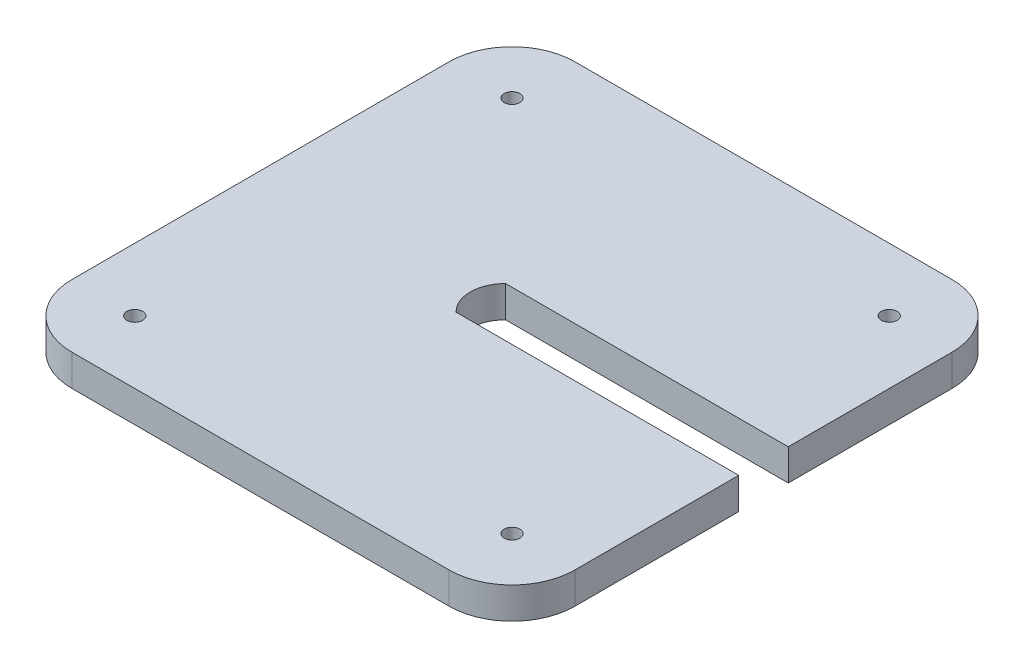
ISO-10303-21;
HEADER;
FILE_DESCRIPTION(('STEP AP214'),'2;1');
FILE_NAME('part.step','',(''),(''),'','','');
FILE_SCHEMA(('AUTOMOTIVE_DESIGN { 1 0 10303 214 1 1 1 1 }'));
ENDSEC;
DATA;
#1=APPLICATION_CONTEXT('core data for automotive mechanical design processes');
#2=APPLICATION_PROTOCOL_DEFINITION('international standard','automotive_design',2000,#1);
#3=PRODUCT_CONTEXT('',#1,'mechanical');
#4=PRODUCT('Part','Part','',(#3));
#5=PRODUCT_RELATED_PRODUCT_CATEGORY('part','',(#4));
#6=PRODUCT_DEFINITION_FORMATION('','',#4);
#7=PRODUCT_DEFINITION_CONTEXT('part definition',#1,'design');
#8=PRODUCT_DEFINITION('design','',#6,#7);
#9=PRODUCT_DEFINITION_SHAPE('','',#8);
#10=(LENGTH_UNIT() NAMED_UNIT(*) SI_UNIT(.MILLI.,.METRE.));
#11=(NAMED_UNIT(*) PLANE_ANGLE_UNIT() SI_UNIT($,.RADIAN.));
#12=(NAMED_UNIT(*) SI_UNIT($,.STERADIAN.) SOLID_ANGLE_UNIT());
#13=UNCERTAINTY_MEASURE_WITH_UNIT(LENGTH_MEASURE(1.E-05),#10,'distance_accuracy_value','');
#14=(GEOMETRIC_REPRESENTATION_CONTEXT(3) GLOBAL_UNCERTAINTY_ASSIGNED_CONTEXT((#13)) GLOBAL_UNIT_ASSIGNED_CONTEXT((#10,
#11,#12)) REPRESENTATION_CONTEXT('',''));
#15=CARTESIAN_POINT('',(0.,0.,0.));
#16=DIRECTION('',(0.,0.,1.));
#17=DIRECTION('',(1.,0.,0.));
#18=AXIS2_PLACEMENT_3D('',#15,#16,#17);
#19=CARTESIAN_POINT('',(11.2532201812331,6.35,41.3444861497398));
#20=DIRECTION('',(0.,1.,0.));
#21=DIRECTION('',(0.,0.,1.));
#22=AXIS2_PLACEMENT_3D('',#19,#20,#21);
#23=PLANE('',#22);
#24=CARTESIAN_POINT('',(50.751864614128,6.35,3.24448614973978));
#25=DIRECTION('',(0.,1.,0.));
#26=DIRECTION('',(0.,0.,1.));
#27=AXIS2_PLACEMENT_3D('',#24,#25,#26);
#28=CIRCLE('',#27,1.58749999999996);
#29=CARTESIAN_POINT('',(50.751864614128,6.35,4.83198614973974));
#30=VERTEX_POINT('',#29);
#31=EDGE_CURVE('E423',#30,#30,#28,.T.);
#32=ORIENTED_EDGE('',*,*,#31,.F.);
#33=EDGE_LOOP('',(#32));
#34=FACE_BOUND('',#33,.T.);
#35=CARTESIAN_POINT('',(-25.448135385872,6.35,79.4444861497398));
#36=DIRECTION('',(0.,1.,0.));
#37=DIRECTION('',(0.,0.,1.));
#38=AXIS2_PLACEMENT_3D('',#35,#36,#37);
#39=CIRCLE('',#38,1.58750000000002);
#40=CARTESIAN_POINT('',(-25.448135385872,6.35,81.0319861497398));
#41=VERTEX_POINT('',#40);
#42=EDGE_CURVE('E161',#41,#41,#39,.T.);
#43=ORIENTED_EDGE('',*,*,#42,.F.);
#44=EDGE_LOOP('',(#43));
#45=FACE_BOUND('',#44,.T.);
#46=DIRECTION('',(-1.,0.,0.));
#47=VECTOR('',#46,1.);
#48=CARTESIAN_POINT('',(18.2462830870348,6.35,46.3482861497397));
#49=LINE('',#48,#47);
#50=CARTESIAN_POINT('',(63.451864614128,6.35,46.3482861497397));
#51=VERTEX_POINT('',#50);
#52=CARTESIAN_POINT('',(6.35812392477375,6.35,46.3482861497397));
#53=VERTEX_POINT('',#52);
#54=EDGE_CURVE('E49',#51,#53,#49,.T.);
#55=ORIENTED_EDGE('',*,*,#54,.T.);
#56=CARTESIAN_POINT('',(11.2532201812331,6.35,41.3444861497398));
#57=DIRECTION('',(0.,-1.,0.));
#58=DIRECTION('',(0.,0.,1.));
#59=AXIS2_PLACEMENT_3D('',#56,#57,#58);
#60=CIRCLE('',#59,6.99999870000001);
#61=CARTESIAN_POINT('',(6.35812392477375,6.35,36.3406861497398));
#62=VERTEX_POINT('',#61);
#63=EDGE_CURVE('E105',#53,#62,#60,.T.);
#64=ORIENTED_EDGE('',*,*,#63,.T.);
#65=DIRECTION('',(1.,0.,0.));
#66=VECTOR('',#65,1.);
#67=CARTESIAN_POINT('',(18.2462830870348,6.35,36.3406861497398));
#68=LINE('',#67,#66);
#69=CARTESIAN_POINT('',(63.451864614128,6.35,36.3406861497398));
#70=VERTEX_POINT('',#69);
#71=EDGE_CURVE('E205',#62,#70,#68,.T.);
#72=ORIENTED_EDGE('',*,*,#71,.T.);
#73=DIRECTION('',(0.,0.,-1.));
#74=VECTOR('',#73,1.);
#75=CARTESIAN_POINT('',(63.451864614128,6.35,36.3406861497398));
#76=LINE('',#75,#74);
#77=CARTESIAN_POINT('',(63.451864614128,6.35,3.24448614973978));
#78=VERTEX_POINT('',#77);
#79=EDGE_CURVE('E225',#70,#78,#76,.T.);
#80=ORIENTED_EDGE('',*,*,#79,.T.);
#81=CARTESIAN_POINT('',(50.751864614128,6.35,3.24448614973978));
#82=DIRECTION('',(0.,1.,0.));
#83=DIRECTION('',(0.,0.,1.));
#84=AXIS2_PLACEMENT_3D('',#81,#82,#83);
#85=CIRCLE('',#84,12.7000000000001);
#86=CARTESIAN_POINT('',(50.751864614128,6.35,-9.45551385026022));
#87=VERTEX_POINT('',#86);
#88=EDGE_CURVE('E222',#78,#87,#85,.T.);
#89=ORIENTED_EDGE('',*,*,#88,.T.);
#90=DIRECTION('',(-1.,0.,0.));
#91=VECTOR('',#90,1.);
#92=CARTESIAN_POINT('',(-25.4481353858719,6.35,-9.45551385026022));
#93=LINE('',#92,#91);
#94=CARTESIAN_POINT('',(-25.4481353858719,6.35,-9.45551385026022));
#95=VERTEX_POINT('',#94);
#96=EDGE_CURVE('E224',#87,#95,#93,.T.);
#97=ORIENTED_EDGE('',*,*,#96,.T.);
#98=CARTESIAN_POINT('',(-25.448135385872,6.35,3.24448614973978));
#99=DIRECTION('',(0.,1.,0.));
#100=DIRECTION('',(0.,0.,1.));
#101=AXIS2_PLACEMENT_3D('',#98,#99,#100);
#102=CIRCLE('',#101,12.7);
#103=CARTESIAN_POINT('',(-38.148135385872,6.35,3.24448614973978));
#104=VERTEX_POINT('',#103);
#105=EDGE_CURVE('E227',#95,#104,#102,.T.);
#106=ORIENTED_EDGE('',*,*,#105,.T.);
#107=DIRECTION('',(0.,0.,1.));
#108=VECTOR('',#107,1.);
#109=CARTESIAN_POINT('',(-38.148135385872,6.35,3.24448614973978));
#110=LINE('',#109,#108);
#111=CARTESIAN_POINT('',(-38.148135385872,6.35,79.4444861497398));
#112=VERTEX_POINT('',#111);
#113=EDGE_CURVE('E233',#104,#112,#110,.T.);
#114=ORIENTED_EDGE('',*,*,#113,.T.);
#115=CARTESIAN_POINT('',(-25.448135385872,6.35,79.4444861497398));
#116=DIRECTION('',(0.,1.,0.));
#117=DIRECTION('',(0.,0.,1.));
#118=AXIS2_PLACEMENT_3D('',#115,#116,#117);
#119=CIRCLE('',#118,12.7);
#120=CARTESIAN_POINT('',(-25.448135385872,6.35,92.1444861497398));
#121=VERTEX_POINT('',#120);
#122=EDGE_CURVE('E137',#112,#121,#119,.T.);
#123=ORIENTED_EDGE('',*,*,#122,.T.);
#124=DIRECTION('',(1.,0.,0.));
#125=VECTOR('',#124,1.);
#126=CARTESIAN_POINT('',(-25.448135385872,6.35,92.1444861497398));
#127=LINE('',#126,#125);
#128=CARTESIAN_POINT('',(50.751864614128,6.35,92.1444861497398));
#129=VERTEX_POINT('',#128);
#130=EDGE_CURVE('E131',#121,#129,#127,.T.);
#131=ORIENTED_EDGE('',*,*,#130,.T.);
#132=CARTESIAN_POINT('',(50.751864614128,6.35,79.4444861497398));
#133=DIRECTION('',(0.,1.,0.));
#134=DIRECTION('',(0.,0.,1.));
#135=AXIS2_PLACEMENT_3D('',#132,#133,#134);
#136=CIRCLE('',#135,12.7);
#137=CARTESIAN_POINT('',(63.451864614128,6.35,79.4444861497398));
#138=VERTEX_POINT('',#137);
#139=EDGE_CURVE('E135',#129,#138,#136,.T.);
#140=ORIENTED_EDGE('',*,*,#139,.T.);
#141=DIRECTION('',(0.,0.,-1.));
#142=VECTOR('',#141,1.);
#143=CARTESIAN_POINT('',(63.451864614128,6.35,79.4444861497398));
#144=LINE('',#143,#142);
#145=EDGE_CURVE('E151',#138,#51,#144,.T.);
#146=ORIENTED_EDGE('',*,*,#145,.T.);
#147=EDGE_LOOP('',(#55,#64,#72,#80,#89,#97,#106,#114,#123,#131,#140,#146));
#148=FACE_BOUND('',#147,.T.);
#149=CARTESIAN_POINT('',(50.751864614128,6.35,79.4444861497398));
#150=DIRECTION('',(0.,1.,0.));
#151=DIRECTION('',(0.,0.,1.));
#152=AXIS2_PLACEMENT_3D('',#149,#150,#151);
#153=CIRCLE('',#152,1.58749999999996);
#154=CARTESIAN_POINT('',(50.751864614128,6.35,81.0319861497397));
#155=VERTEX_POINT('',#154);
#156=EDGE_CURVE('E429',#155,#155,#153,.T.);
#157=ORIENTED_EDGE('',*,*,#156,.F.);
#158=EDGE_LOOP('',(#157));
#159=FACE_BOUND('',#158,.T.);
#160=CARTESIAN_POINT('',(-25.448135385872,6.35,3.24448614973978));
#161=DIRECTION('',(0.,1.,0.));
#162=DIRECTION('',(0.,0.,1.));
#163=AXIS2_PLACEMENT_3D('',#160,#161,#162);
#164=CIRCLE('',#163,1.58750000000002);
#165=CARTESIAN_POINT('',(-25.448135385872,6.35,4.8319861497398));
#166=VERTEX_POINT('',#165);
#167=EDGE_CURVE('E414',#166,#166,#164,.T.);
#168=ORIENTED_EDGE('',*,*,#167,.F.);
#169=EDGE_LOOP('',(#168));
#170=FACE_BOUND('',#169,.T.);
#171=ADVANCED_FACE('F32',(#34,#45,#148,#159,#170),#23,.T.);
#172=CARTESIAN_POINT('',(11.2532201812331,0.,41.3444861497398));
#173=DIRECTION('',(0.,1.,0.));
#174=DIRECTION('',(0.,0.,1.));
#175=AXIS2_PLACEMENT_3D('',#172,#173,#174);
#176=PLANE('',#175);
#177=CARTESIAN_POINT('',(11.2532201812331,0.,41.3444861497398));
#178=DIRECTION('',(0.,-1.,0.));
#179=DIRECTION('',(0.,0.,1.));
#180=AXIS2_PLACEMENT_3D('',#177,#178,#179);
#181=CIRCLE('',#180,6.99999870000001);
#182=CARTESIAN_POINT('',(6.35812392477375,0.,46.3482861497397));
#183=VERTEX_POINT('',#182);
#184=CARTESIAN_POINT('',(6.35812392477375,0.,36.3406861497398));
#185=VERTEX_POINT('',#184);
#186=EDGE_CURVE('E157',#183,#185,#181,.T.);
#187=ORIENTED_EDGE('',*,*,#186,.F.);
#188=DIRECTION('',(-1.,0.,0.));
#189=VECTOR('',#188,1.);
#190=CARTESIAN_POINT('',(18.2462830870348,0.,46.3482861497397));
#191=LINE('',#190,#189);
#192=CARTESIAN_POINT('',(63.451864614128,0.,46.3482861497397));
#193=VERTEX_POINT('',#192);
#194=EDGE_CURVE('E178',#193,#183,#191,.T.);
#195=ORIENTED_EDGE('',*,*,#194,.F.);
#196=DIRECTION('',(0.,0.,-1.));
#197=VECTOR('',#196,1.);
#198=CARTESIAN_POINT('',(63.451864614128,0.,79.4444861497398));
#199=LINE('',#198,#197);
#200=CARTESIAN_POINT('',(63.451864614128,0.,79.4444861497398));
#201=VERTEX_POINT('',#200);
#202=EDGE_CURVE('E98',#201,#193,#199,.T.);
#203=ORIENTED_EDGE('',*,*,#202,.F.);
#204=CARTESIAN_POINT('',(50.751864614128,0.,79.4444861497398));
#205=DIRECTION('',(0.,1.,0.));
#206=DIRECTION('',(0.,0.,1.));
#207=AXIS2_PLACEMENT_3D('',#204,#205,#206);
#208=CIRCLE('',#207,12.7);
#209=CARTESIAN_POINT('',(50.751864614128,0.,92.1444861497398));
#210=VERTEX_POINT('',#209);
#211=EDGE_CURVE('E91',#210,#201,#208,.T.);
#212=ORIENTED_EDGE('',*,*,#211,.F.);
#213=DIRECTION('',(1.,0.,0.));
#214=VECTOR('',#213,1.);
#215=CARTESIAN_POINT('',(-25.448135385872,0.,92.1444861497398));
#216=LINE('',#215,#214);
#217=CARTESIAN_POINT('',(-25.448135385872,0.,92.1444861497398));
#218=VERTEX_POINT('',#217);
#219=EDGE_CURVE('E145',#218,#210,#216,.T.);
#220=ORIENTED_EDGE('',*,*,#219,.F.);
#221=CARTESIAN_POINT('',(-25.448135385872,0.,79.4444861497398));
#222=DIRECTION('',(0.,1.,0.));
#223=DIRECTION('',(0.,0.,1.));
#224=AXIS2_PLACEMENT_3D('',#221,#222,#223);
#225=CIRCLE('',#224,12.7);
#226=CARTESIAN_POINT('',(-38.148135385872,0.,79.4444861497398));
#227=VERTEX_POINT('',#226);
#228=EDGE_CURVE('E173',#227,#218,#225,.T.);
#229=ORIENTED_EDGE('',*,*,#228,.F.);
#230=DIRECTION('',(0.,0.,1.));
#231=VECTOR('',#230,1.);
#232=CARTESIAN_POINT('',(-38.148135385872,0.,3.24448614973978));
#233=LINE('',#232,#231);
#234=CARTESIAN_POINT('',(-38.148135385872,0.,3.24448614973978));
#235=VERTEX_POINT('',#234);
#236=EDGE_CURVE('E171',#235,#227,#233,.T.);
#237=ORIENTED_EDGE('',*,*,#236,.F.);
#238=CARTESIAN_POINT('',(-25.448135385872,0.,3.24448614973978));
#239=DIRECTION('',(0.,1.,0.));
#240=DIRECTION('',(0.,0.,1.));
#241=AXIS2_PLACEMENT_3D('',#238,#239,#240);
#242=CIRCLE('',#241,12.7);
#243=CARTESIAN_POINT('',(-25.4481353858719,0.,-9.45551385026022));
#244=VERTEX_POINT('',#243);
#245=EDGE_CURVE('E169',#244,#235,#242,.T.);
#246=ORIENTED_EDGE('',*,*,#245,.F.);
#247=DIRECTION('',(-1.,0.,0.));
#248=VECTOR('',#247,1.);
#249=CARTESIAN_POINT('',(-25.4481353858719,0.,-9.45551385026022));
#250=LINE('',#249,#248);
#251=CARTESIAN_POINT('',(50.751864614128,0.,-9.45551385026022));
#252=VERTEX_POINT('',#251);
#253=EDGE_CURVE('E167',#252,#244,#250,.T.);
#254=ORIENTED_EDGE('',*,*,#253,.F.);
#255=CARTESIAN_POINT('',(50.751864614128,0.,3.24448614973978));
#256=DIRECTION('',(0.,1.,0.));
#257=DIRECTION('',(0.,0.,1.));
#258=AXIS2_PLACEMENT_3D('',#255,#256,#257);
#259=CIRCLE('',#258,12.7000000000001);
#260=CARTESIAN_POINT('',(63.451864614128,0.,3.24448614973978));
#261=VERTEX_POINT('',#260);
#262=EDGE_CURVE('E165',#261,#252,#259,.T.);
#263=ORIENTED_EDGE('',*,*,#262,.F.);
#264=DIRECTION('',(0.,0.,-1.));
#265=VECTOR('',#264,1.);
#266=CARTESIAN_POINT('',(63.451864614128,0.,36.3406861497398));
#267=LINE('',#266,#265);
#268=CARTESIAN_POINT('',(63.451864614128,0.,36.3406861497398));
#269=VERTEX_POINT('',#268);
#270=EDGE_CURVE('E163',#269,#261,#267,.T.);
#271=ORIENTED_EDGE('',*,*,#270,.F.);
#272=DIRECTION('',(1.,0.,0.));
#273=VECTOR('',#272,1.);
#274=CARTESIAN_POINT('',(18.2462830870348,0.,36.3406861497398));
#275=LINE('',#274,#273);
#276=EDGE_CURVE('E160',#185,#269,#275,.T.);
#277=ORIENTED_EDGE('',*,*,#276,.F.);
#278=EDGE_LOOP('',(#187,#195,#203,#212,#220,#229,#237,#246,#254,#263,#271,#277));
#279=FACE_BOUND('',#278,.T.);
#280=CARTESIAN_POINT('',(-25.448135385872,0.,79.4444861497398));
#281=DIRECTION('',(0.,1.,0.));
#282=DIRECTION('',(0.,0.,1.));
#283=AXIS2_PLACEMENT_3D('',#280,#281,#282);
#284=CIRCLE('',#283,1.58750000000002);
#285=CARTESIAN_POINT('',(-25.448135385872,0.,81.0319861497398));
#286=VERTEX_POINT('',#285);
#287=EDGE_CURVE('E432',#286,#286,#284,.T.);
#288=ORIENTED_EDGE('',*,*,#287,.T.);
#289=EDGE_LOOP('',(#288));
#290=FACE_BOUND('',#289,.T.);
#291=CARTESIAN_POINT('',(50.751864614128,0.,79.4444861497398));
#292=DIRECTION('',(0.,1.,0.));
#293=DIRECTION('',(0.,0.,1.));
#294=AXIS2_PLACEMENT_3D('',#291,#292,#293);
#295=CIRCLE('',#294,1.58749999999996);
#296=CARTESIAN_POINT('',(50.751864614128,0.,81.0319861497397));
#297=VERTEX_POINT('',#296);
#298=EDGE_CURVE('E426',#297,#297,#295,.T.);
#299=ORIENTED_EDGE('',*,*,#298,.T.);
#300=EDGE_LOOP('',(#299));
#301=FACE_BOUND('',#300,.T.);
#302=CARTESIAN_POINT('',(50.751864614128,0.,3.24448614973978));
#303=DIRECTION('',(0.,1.,0.));
#304=DIRECTION('',(0.,0.,1.));
#305=AXIS2_PLACEMENT_3D('',#302,#303,#304);
#306=CIRCLE('',#305,1.58749999999996);
#307=CARTESIAN_POINT('',(50.751864614128,0.,4.83198614973974));
#308=VERTEX_POINT('',#307);
#309=EDGE_CURVE('E420',#308,#308,#306,.T.);
#310=ORIENTED_EDGE('',*,*,#309,.T.);
#311=EDGE_LOOP('',(#310));
#312=FACE_BOUND('',#311,.T.);
#313=CARTESIAN_POINT('',(-25.448135385872,0.,3.24448614973978));
#314=DIRECTION('',(0.,1.,0.));
#315=DIRECTION('',(0.,0.,1.));
#316=AXIS2_PLACEMENT_3D('',#313,#314,#315);
#317=CIRCLE('',#316,1.58750000000002);
#318=CARTESIAN_POINT('',(-25.448135385872,0.,4.8319861497398));
#319=VERTEX_POINT('',#318);
#320=EDGE_CURVE('E417',#319,#319,#317,.T.);
#321=ORIENTED_EDGE('',*,*,#320,.T.);
#322=EDGE_LOOP('',(#321));
#323=FACE_BOUND('',#322,.T.);
#324=ADVANCED_FACE('F209',(#279,#290,#301,#312,#323),#176,.F.);
#325=CARTESIAN_POINT('',(11.2532201812331,6.35,41.3444861497398));
#326=DIRECTION('',(0.,-1.,0.));
#327=DIRECTION('',(0.,0.,-1.));
#328=AXIS2_PLACEMENT_3D('',#325,#326,#327);
#329=CYLINDRICAL_SURFACE('',#328,6.99999870000001);
#330=ORIENTED_EDGE('',*,*,#186,.T.);
#331=DIRECTION('',(0.,-1.,0.));
#332=VECTOR('',#331,1.);
#333=CARTESIAN_POINT('',(6.35812392477375,6.35,36.3406861497398));
#334=LINE('',#333,#332);
#335=EDGE_CURVE('E41',#62,#185,#334,.T.);
#336=ORIENTED_EDGE('',*,*,#335,.F.);
#337=ORIENTED_EDGE('',*,*,#63,.F.);
#338=DIRECTION('',(0.,-1.,0.));
#339=VECTOR('',#338,1.);
#340=CARTESIAN_POINT('',(6.35812392477375,6.35,46.3482861497397));
#341=LINE('',#340,#339);
#342=EDGE_CURVE('E11',#53,#183,#341,.T.);
#343=ORIENTED_EDGE('',*,*,#342,.T.);
#344=EDGE_LOOP('',(#330,#336,#337,#343));
#345=FACE_BOUND('',#344,.T.);
#346=ADVANCED_FACE('F34',(#345),#329,.F.);
#347=CARTESIAN_POINT('',(18.2462830870348,6.35,36.3406861497398));
#348=DIRECTION('',(0.,0.,-1.));
#349=DIRECTION('',(-1.,0.,0.));
#350=AXIS2_PLACEMENT_3D('',#347,#348,#349);
#351=PLANE('',#350);
#352=ORIENTED_EDGE('',*,*,#276,.T.);
#353=DIRECTION('',(0.,-1.,0.));
#354=VECTOR('',#353,1.);
#355=CARTESIAN_POINT('',(63.451864614128,6.35,36.3406861497398));
#356=LINE('',#355,#354);
#357=EDGE_CURVE('E198',#70,#269,#356,.T.);
#358=ORIENTED_EDGE('',*,*,#357,.F.);
#359=ORIENTED_EDGE('',*,*,#71,.F.);
#360=ORIENTED_EDGE('',*,*,#335,.T.);
#361=EDGE_LOOP('',(#352,#358,#359,#360));
#362=FACE_BOUND('',#361,.T.);
#363=ADVANCED_FACE('F203',(#362),#351,.F.);
#364=CARTESIAN_POINT('',(63.451864614128,6.35,36.3406861497398));
#365=DIRECTION('',(-1.,0.,0.));
#366=DIRECTION('',(0.,0.,1.));
#367=AXIS2_PLACEMENT_3D('',#364,#365,#366);
#368=PLANE('',#367);
#369=ORIENTED_EDGE('',*,*,#270,.T.);
#370=DIRECTION('',(0.,-1.,0.));
#371=VECTOR('',#370,1.);
#372=CARTESIAN_POINT('',(63.451864614128,6.35,3.24448614973978));
#373=LINE('',#372,#371);
#374=EDGE_CURVE('E195',#78,#261,#373,.T.);
#375=ORIENTED_EDGE('',*,*,#374,.F.);
#376=ORIENTED_EDGE('',*,*,#79,.F.);
#377=ORIENTED_EDGE('',*,*,#357,.T.);
#378=EDGE_LOOP('',(#369,#375,#376,#377));
#379=FACE_BOUND('',#378,.T.);
#380=ADVANCED_FACE('F216',(#379),#368,.F.);
#381=CARTESIAN_POINT('',(50.751864614128,6.35,3.24448614973978));
#382=DIRECTION('',(0.,-1.,0.));
#383=DIRECTION('',(0.,0.,-1.));
#384=AXIS2_PLACEMENT_3D('',#381,#382,#383);
#385=CYLINDRICAL_SURFACE('',#384,12.7000000000001);
#386=ORIENTED_EDGE('',*,*,#262,.T.);
#387=DIRECTION('',(0.,-1.,0.));
#388=VECTOR('',#387,1.);
#389=CARTESIAN_POINT('',(50.751864614128,6.35,-9.45551385026022));
#390=LINE('',#389,#388);
#391=EDGE_CURVE('E192',#87,#252,#390,.T.);
#392=ORIENTED_EDGE('',*,*,#391,.F.);
#393=ORIENTED_EDGE('',*,*,#88,.F.);
#394=ORIENTED_EDGE('',*,*,#374,.T.);
#395=EDGE_LOOP('',(#386,#392,#393,#394));
#396=FACE_BOUND('',#395,.T.);
#397=ADVANCED_FACE('F220',(#396),#385,.T.);
#398=CARTESIAN_POINT('',(-25.4481353858719,6.35,-9.45551385026022));
#399=DIRECTION('',(0.,0.,1.));
#400=DIRECTION('',(1.,0.,0.));
#401=AXIS2_PLACEMENT_3D('',#398,#399,#400);
#402=PLANE('',#401);
#403=ORIENTED_EDGE('',*,*,#253,.T.);
#404=DIRECTION('',(0.,-1.,0.));
#405=VECTOR('',#404,1.);
#406=CARTESIAN_POINT('',(-25.4481353858719,6.35,-9.45551385026022));
#407=LINE('',#406,#405);
#408=EDGE_CURVE('E189',#95,#244,#407,.T.);
#409=ORIENTED_EDGE('',*,*,#408,.F.);
#410=ORIENTED_EDGE('',*,*,#96,.F.);
#411=ORIENTED_EDGE('',*,*,#391,.T.);
#412=EDGE_LOOP('',(#403,#409,#410,#411));
#413=FACE_BOUND('',#412,.T.);
#414=ADVANCED_FACE('F249',(#413),#402,.F.);
#415=CARTESIAN_POINT('',(-25.448135385872,6.35,3.24448614973978));
#416=DIRECTION('',(0.,-1.,0.));
#417=DIRECTION('',(0.,0.,-1.));
#418=AXIS2_PLACEMENT_3D('',#415,#416,#417);
#419=CYLINDRICAL_SURFACE('',#418,12.7);
#420=ORIENTED_EDGE('',*,*,#245,.T.);
#421=DIRECTION('',(0.,-1.,0.));
#422=VECTOR('',#421,1.);
#423=CARTESIAN_POINT('',(-38.148135385872,6.35,3.24448614973978));
#424=LINE('',#423,#422);
#425=EDGE_CURVE('E186',#104,#235,#424,.T.);
#426=ORIENTED_EDGE('',*,*,#425,.F.);
#427=ORIENTED_EDGE('',*,*,#105,.F.);
#428=ORIENTED_EDGE('',*,*,#408,.T.);
#429=EDGE_LOOP('',(#420,#426,#427,#428));
#430=FACE_BOUND('',#429,.T.);
#431=ADVANCED_FACE('F246',(#430),#419,.T.);
#432=CARTESIAN_POINT('',(-38.148135385872,6.35,3.24448614973978));
#433=DIRECTION('',(1.,0.,0.));
#434=DIRECTION('',(0.,0.,-1.));
#435=AXIS2_PLACEMENT_3D('',#432,#433,#434);
#436=PLANE('',#435);
#437=ORIENTED_EDGE('',*,*,#236,.T.);
#438=DIRECTION('',(0.,-1.,0.));
#439=VECTOR('',#438,1.);
#440=CARTESIAN_POINT('',(-38.148135385872,6.35,79.4444861497398));
#441=LINE('',#440,#439);
#442=EDGE_CURVE('E183',#112,#227,#441,.T.);
#443=ORIENTED_EDGE('',*,*,#442,.F.);
#444=ORIENTED_EDGE('',*,*,#113,.F.);
#445=ORIENTED_EDGE('',*,*,#425,.T.);
#446=EDGE_LOOP('',(#437,#443,#444,#445));
#447=FACE_BOUND('',#446,.T.);
#448=ADVANCED_FACE('F239',(#447),#436,.F.);
#449=CARTESIAN_POINT('',(-25.448135385872,6.35,79.4444861497398));
#450=DIRECTION('',(0.,-1.,0.));
#451=DIRECTION('',(0.,0.,-1.));
#452=AXIS2_PLACEMENT_3D('',#449,#450,#451);
#453=CYLINDRICAL_SURFACE('',#452,12.7);
#454=ORIENTED_EDGE('',*,*,#228,.T.);
#455=DIRECTION('',(0.,-1.,0.));
#456=VECTOR('',#455,1.);
#457=CARTESIAN_POINT('',(-25.448135385872,6.35,92.1444861497398));
#458=LINE('',#457,#456);
#459=EDGE_CURVE('E146',#121,#218,#458,.T.);
#460=ORIENTED_EDGE('',*,*,#459,.F.);
#461=ORIENTED_EDGE('',*,*,#122,.F.);
#462=ORIENTED_EDGE('',*,*,#442,.T.);
#463=EDGE_LOOP('',(#454,#460,#461,#462));
#464=FACE_BOUND('',#463,.T.);
#465=ADVANCED_FACE('F243',(#464),#453,.T.);
#466=CARTESIAN_POINT('',(-25.448135385872,6.35,92.1444861497398));
#467=DIRECTION('',(0.,0.,-1.));
#468=DIRECTION('',(-1.,0.,0.));
#469=AXIS2_PLACEMENT_3D('',#466,#467,#468);
#470=PLANE('',#469);
#471=ORIENTED_EDGE('',*,*,#219,.T.);
#472=DIRECTION('',(0.,-1.,0.));
#473=VECTOR('',#472,1.);
#474=CARTESIAN_POINT('',(50.751864614128,6.35,92.1444861497398));
#475=LINE('',#474,#473);
#476=EDGE_CURVE('E142',#129,#210,#475,.T.);
#477=ORIENTED_EDGE('',*,*,#476,.F.);
#478=ORIENTED_EDGE('',*,*,#130,.F.);
#479=ORIENTED_EDGE('',*,*,#459,.T.);
#480=EDGE_LOOP('',(#471,#477,#478,#479));
#481=FACE_BOUND('',#480,.T.);
#482=ADVANCED_FACE('F143',(#481),#470,.F.);
#483=CARTESIAN_POINT('',(50.751864614128,6.35,79.4444861497398));
#484=DIRECTION('',(0.,-1.,0.));
#485=DIRECTION('',(0.,0.,-1.));
#486=AXIS2_PLACEMENT_3D('',#483,#484,#485);
#487=CYLINDRICAL_SURFACE('',#486,12.7);
#488=ORIENTED_EDGE('',*,*,#211,.T.);
#489=DIRECTION('',(0.,-1.,0.));
#490=VECTOR('',#489,1.);
#491=CARTESIAN_POINT('',(63.451864614128,6.35,79.4444861497398));
#492=LINE('',#491,#490);
#493=EDGE_CURVE('E147',#138,#201,#492,.T.);
#494=ORIENTED_EDGE('',*,*,#493,.F.);
#495=ORIENTED_EDGE('',*,*,#139,.F.);
#496=ORIENTED_EDGE('',*,*,#476,.T.);
#497=EDGE_LOOP('',(#488,#494,#495,#496));
#498=FACE_BOUND('',#497,.T.);
#499=ADVANCED_FACE('F149',(#498),#487,.T.);
#500=CARTESIAN_POINT('',(63.451864614128,6.35,79.4444861497398));
#501=DIRECTION('',(-1.,0.,0.));
#502=DIRECTION('',(0.,0.,1.));
#503=AXIS2_PLACEMENT_3D('',#500,#501,#502);
#504=PLANE('',#503);
#505=ORIENTED_EDGE('',*,*,#202,.T.);
#506=DIRECTION('',(0.,-1.,0.));
#507=VECTOR('',#506,1.);
#508=CARTESIAN_POINT('',(63.451864614128,6.35,46.3482861497397));
#509=LINE('',#508,#507);
#510=EDGE_CURVE('E153',#51,#193,#509,.T.);
#511=ORIENTED_EDGE('',*,*,#510,.F.);
#512=ORIENTED_EDGE('',*,*,#145,.F.);
#513=ORIENTED_EDGE('',*,*,#493,.T.);
#514=EDGE_LOOP('',(#505,#511,#512,#513));
#515=FACE_BOUND('',#514,.T.);
#516=ADVANCED_FACE('F274',(#515),#504,.F.);
#517=CARTESIAN_POINT('',(18.2462830870348,6.35,46.3482861497397));
#518=DIRECTION('',(0.,0.,1.));
#519=DIRECTION('',(1.,0.,0.));
#520=AXIS2_PLACEMENT_3D('',#517,#518,#519);
#521=PLANE('',#520);
#522=ORIENTED_EDGE('',*,*,#194,.T.);
#523=ORIENTED_EDGE('',*,*,#342,.F.);
#524=ORIENTED_EDGE('',*,*,#54,.F.);
#525=ORIENTED_EDGE('',*,*,#510,.T.);
#526=EDGE_LOOP('',(#522,#523,#524,#525));
#527=FACE_BOUND('',#526,.T.);
#528=ADVANCED_FACE('F271',(#527),#521,.F.);
#529=CARTESIAN_POINT('',(-25.448135385872,6.35,79.4444861497398));
#530=DIRECTION('',(0.,-1.,0.));
#531=DIRECTION('',(0.,0.,-1.));
#532=AXIS2_PLACEMENT_3D('',#529,#530,#531);
#533=CYLINDRICAL_SURFACE('',#532,1.58750000000002);
#534=ORIENTED_EDGE('',*,*,#42,.T.);
#535=EDGE_LOOP('',(#534));
#536=FACE_BOUND('',#535,.T.);
#537=ORIENTED_EDGE('',*,*,#287,.F.);
#538=EDGE_LOOP('',(#537));
#539=FACE_BOUND('',#538,.T.);
#540=ADVANCED_FACE('F268',(#536,#539),#533,.F.);
#541=CARTESIAN_POINT('',(50.751864614128,6.35,79.4444861497398));
#542=DIRECTION('',(0.,-1.,0.));
#543=DIRECTION('',(0.,0.,-1.));
#544=AXIS2_PLACEMENT_3D('',#541,#542,#543);
#545=CYLINDRICAL_SURFACE('',#544,1.58749999999996);
#546=ORIENTED_EDGE('',*,*,#156,.T.);
#547=EDGE_LOOP('',(#546));
#548=FACE_BOUND('',#547,.T.);
#549=ORIENTED_EDGE('',*,*,#298,.F.);
#550=EDGE_LOOP('',(#549));
#551=FACE_BOUND('',#550,.T.);
#552=ADVANCED_FACE('F314',(#548,#551),#545,.F.);
#553=CARTESIAN_POINT('',(50.751864614128,6.35,3.24448614973978));
#554=DIRECTION('',(0.,-1.,0.));
#555=DIRECTION('',(0.,0.,-1.));
#556=AXIS2_PLACEMENT_3D('',#553,#554,#555);
#557=CYLINDRICAL_SURFACE('',#556,1.58749999999996);
#558=ORIENTED_EDGE('',*,*,#31,.T.);
#559=EDGE_LOOP('',(#558));
#560=FACE_BOUND('',#559,.T.);
#561=ORIENTED_EDGE('',*,*,#309,.F.);
#562=EDGE_LOOP('',(#561));
#563=FACE_BOUND('',#562,.T.);
#564=ADVANCED_FACE('F321',(#560,#563),#557,.F.);
#565=CARTESIAN_POINT('',(-25.448135385872,6.35,3.24448614973978));
#566=DIRECTION('',(0.,-1.,0.));
#567=DIRECTION('',(0.,0.,-1.));
#568=AXIS2_PLACEMENT_3D('',#565,#566,#567);
#569=CYLINDRICAL_SURFACE('',#568,1.58750000000002);
#570=ORIENTED_EDGE('',*,*,#167,.T.);
#571=EDGE_LOOP('',(#570));
#572=FACE_BOUND('',#571,.T.);
#573=ORIENTED_EDGE('',*,*,#320,.F.);
#574=EDGE_LOOP('',(#573));
#575=FACE_BOUND('',#574,.T.);
#576=ADVANCED_FACE('F328',(#572,#575),#569,.F.);
#577=CLOSED_SHELL('',(#171,#324,#346,#363,#380,#397,#414,#431,#448,#465,#482,#499,#516,#528,
#540,#552,#564,#576));
#578=MANIFOLD_SOLID_BREP('B2',#577);
#579=ADVANCED_BREP_SHAPE_REPRESENTATION('',(#18,#578),#14);
#580=SHAPE_DEFINITION_REPRESENTATION(#9,#579);
ENDSEC;
END-ISO-10303-21;
